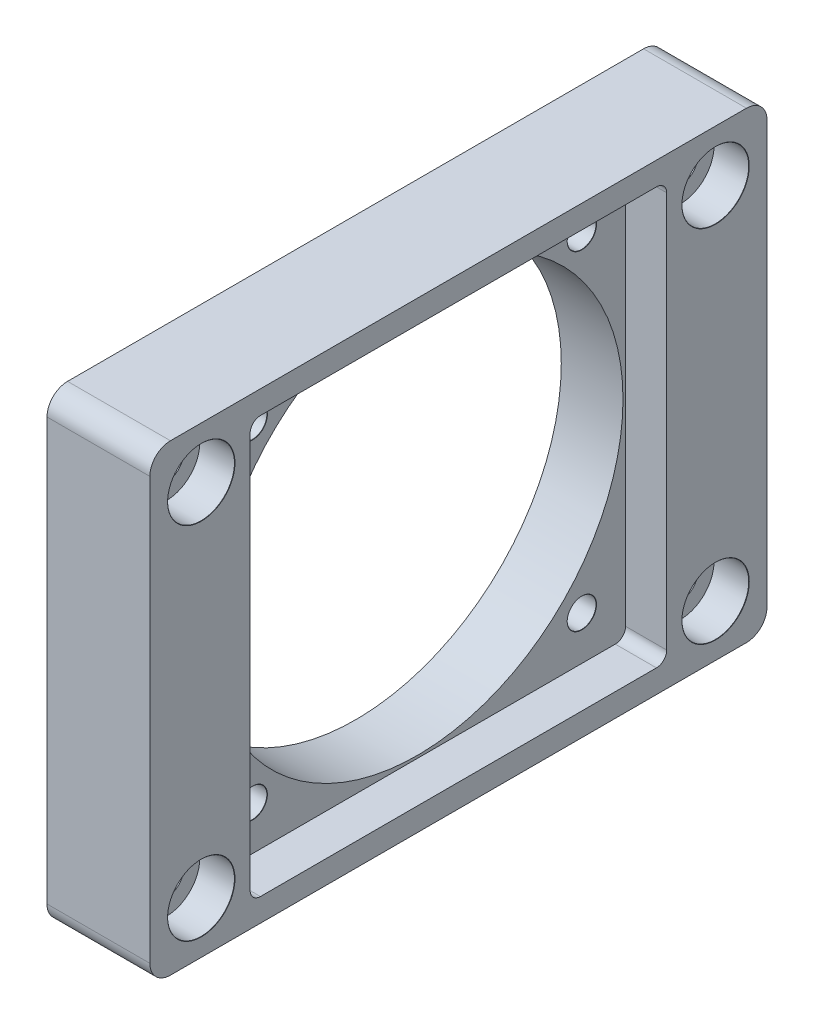
ISO-10303-21;
HEADER;
FILE_DESCRIPTION(('STEP AP214'),'2;1');
FILE_NAME('part.step','',(''),(''),'','','');
FILE_SCHEMA(('AUTOMOTIVE_DESIGN { 1 0 10303 214 1 1 1 1 }'));
ENDSEC;
DATA;
#1=APPLICATION_CONTEXT('core data for automotive mechanical design processes');
#2=APPLICATION_PROTOCOL_DEFINITION('international standard','automotive_design',2000,#1);
#3=PRODUCT_CONTEXT('',#1,'mechanical');
#4=PRODUCT('Part','Part','',(#3));
#5=PRODUCT_RELATED_PRODUCT_CATEGORY('part','',(#4));
#6=PRODUCT_DEFINITION_FORMATION('','',#4);
#7=PRODUCT_DEFINITION_CONTEXT('part definition',#1,'design');
#8=PRODUCT_DEFINITION('design','',#6,#7);
#9=PRODUCT_DEFINITION_SHAPE('','',#8);
#10=(LENGTH_UNIT() NAMED_UNIT(*) SI_UNIT(.MILLI.,.METRE.));
#11=(NAMED_UNIT(*) PLANE_ANGLE_UNIT() SI_UNIT($,.RADIAN.));
#12=(NAMED_UNIT(*) SI_UNIT($,.STERADIAN.) SOLID_ANGLE_UNIT());
#13=UNCERTAINTY_MEASURE_WITH_UNIT(LENGTH_MEASURE(1.E-05),#10,'distance_accuracy_value','');
#14=(GEOMETRIC_REPRESENTATION_CONTEXT(3) GLOBAL_UNCERTAINTY_ASSIGNED_CONTEXT((#13)) GLOBAL_UNIT_ASSIGNED_CONTEXT((#10,
#11,#12)) REPRESENTATION_CONTEXT('',''));
#15=CARTESIAN_POINT('',(0.,0.,0.));
#16=DIRECTION('',(0.,0.,1.));
#17=DIRECTION('',(1.,0.,0.));
#18=AXIS2_PLACEMENT_3D('',#15,#16,#17);
#19=CARTESIAN_POINT('',(10.,22.5,-30.));
#20=DIRECTION('',(0.,0.,1.));
#21=DIRECTION('',(0.,-1.,0.));
#22=AXIS2_PLACEMENT_3D('',#19,#20,#21);
#23=PLANE('',#22);
#24=DIRECTION('',(0.,1.,0.));
#25=VECTOR('',#24,1.);
#26=CARTESIAN_POINT('',(0.,22.5,-30.));
#27=LINE('',#26,#25);
#28=CARTESIAN_POINT('',(0.,-20.5,-30.));
#29=VERTEX_POINT('',#28);
#30=CARTESIAN_POINT('',(0.,20.5,-30.));
#31=VERTEX_POINT('',#30);
#32=EDGE_CURVE('E198',#29,#31,#27,.T.);
#33=ORIENTED_EDGE('',*,*,#32,.T.);
#34=DIRECTION('',(-1.,0.,0.));
#35=VECTOR('',#34,1.);
#36=CARTESIAN_POINT('',(10.,20.5,-30.));
#37=LINE('',#36,#35);
#38=CARTESIAN_POINT('',(10.,20.5,-30.));
#39=VERTEX_POINT('',#38);
#40=EDGE_CURVE('E254',#31,#39,#37,.F.);
#41=ORIENTED_EDGE('',*,*,#40,.T.);
#42=DIRECTION('',(0.,1.,0.));
#43=VECTOR('',#42,1.);
#44=CARTESIAN_POINT('',(10.,22.5,-30.));
#45=LINE('',#44,#43);
#46=CARTESIAN_POINT('',(10.,-20.5,-30.));
#47=VERTEX_POINT('',#46);
#48=EDGE_CURVE('E187',#47,#39,#45,.T.);
#49=ORIENTED_EDGE('',*,*,#48,.F.);
#50=DIRECTION('',(-1.,0.,0.));
#51=VECTOR('',#50,1.);
#52=CARTESIAN_POINT('',(10.,-20.5,-30.));
#53=LINE('',#52,#51);
#54=EDGE_CURVE('E251',#47,#29,#53,.T.);
#55=ORIENTED_EDGE('',*,*,#54,.T.);
#56=EDGE_LOOP('',(#33,#41,#49,#55));
#57=FACE_BOUND('',#56,.T.);
#58=ADVANCED_FACE('F34',(#57),#23,.F.);
#59=CARTESIAN_POINT('',(10.,22.5,30.));
#60=DIRECTION('',(0.,-1.,0.));
#61=DIRECTION('',(0.,0.,-1.));
#62=AXIS2_PLACEMENT_3D('',#59,#60,#61);
#63=PLANE('',#62);
#64=DIRECTION('',(0.,0.,1.));
#65=VECTOR('',#64,1.);
#66=CARTESIAN_POINT('',(10.,22.5,30.));
#67=LINE('',#66,#65);
#68=CARTESIAN_POINT('',(10.,22.5,-28.));
#69=VERTEX_POINT('',#68);
#70=CARTESIAN_POINT('',(10.,22.5,28.));
#71=VERTEX_POINT('',#70);
#72=EDGE_CURVE('E190',#69,#71,#67,.T.);
#73=ORIENTED_EDGE('',*,*,#72,.F.);
#74=DIRECTION('',(-1.,0.,0.));
#75=VECTOR('',#74,1.);
#76=CARTESIAN_POINT('',(10.,22.5,-28.));
#77=LINE('',#76,#75);
#78=CARTESIAN_POINT('',(0.,22.5,-28.));
#79=VERTEX_POINT('',#78);
#80=EDGE_CURVE('E240',#69,#79,#77,.T.);
#81=ORIENTED_EDGE('',*,*,#80,.T.);
#82=DIRECTION('',(0.,0.,1.));
#83=VECTOR('',#82,1.);
#84=CARTESIAN_POINT('',(0.,22.5,30.));
#85=LINE('',#84,#83);
#86=CARTESIAN_POINT('',(0.,22.5,28.));
#87=VERTEX_POINT('',#86);
#88=EDGE_CURVE('E201',#79,#87,#85,.T.);
#89=ORIENTED_EDGE('',*,*,#88,.T.);
#90=DIRECTION('',(-1.,0.,0.));
#91=VECTOR('',#90,1.);
#92=CARTESIAN_POINT('',(10.,22.5,28.));
#93=LINE('',#92,#91);
#94=EDGE_CURVE('E238',#87,#71,#93,.F.);
#95=ORIENTED_EDGE('',*,*,#94,.T.);
#96=EDGE_LOOP('',(#73,#81,#89,#95));
#97=FACE_BOUND('',#96,.T.);
#98=ADVANCED_FACE('F294',(#97),#63,.F.);
#99=CARTESIAN_POINT('',(10.,22.5,30.));
#100=DIRECTION('',(0.,0.,-1.));
#101=DIRECTION('',(0.,1.,0.));
#102=AXIS2_PLACEMENT_3D('',#99,#100,#101);
#103=PLANE('',#102);
#104=DIRECTION('',(0.,-1.,0.));
#105=VECTOR('',#104,1.);
#106=CARTESIAN_POINT('',(10.,22.5,30.));
#107=LINE('',#106,#105);
#108=CARTESIAN_POINT('',(10.,20.5,30.));
#109=VERTEX_POINT('',#108);
#110=CARTESIAN_POINT('',(10.,-20.5,30.));
#111=VERTEX_POINT('',#110);
#112=EDGE_CURVE('E194',#109,#111,#107,.T.);
#113=ORIENTED_EDGE('',*,*,#112,.F.);
#114=DIRECTION('',(-1.,0.,0.));
#115=VECTOR('',#114,1.);
#116=CARTESIAN_POINT('',(10.,20.5,30.));
#117=LINE('',#116,#115);
#118=CARTESIAN_POINT('',(0.,20.5,30.));
#119=VERTEX_POINT('',#118);
#120=EDGE_CURVE('E11',#109,#119,#117,.T.);
#121=ORIENTED_EDGE('',*,*,#120,.T.);
#122=DIRECTION('',(0.,-1.,0.));
#123=VECTOR('',#122,1.);
#124=CARTESIAN_POINT('',(0.,22.5,30.));
#125=LINE('',#124,#123);
#126=CARTESIAN_POINT('',(0.,-20.5,30.));
#127=VERTEX_POINT('',#126);
#128=EDGE_CURVE('E205',#119,#127,#125,.T.);
#129=ORIENTED_EDGE('',*,*,#128,.T.);
#130=DIRECTION('',(-1.,0.,0.));
#131=VECTOR('',#130,1.);
#132=CARTESIAN_POINT('',(10.,-20.5,30.));
#133=LINE('',#132,#131);
#134=EDGE_CURVE('E42',#127,#111,#133,.F.);
#135=ORIENTED_EDGE('',*,*,#134,.T.);
#136=EDGE_LOOP('',(#113,#121,#129,#135));
#137=FACE_BOUND('',#136,.T.);
#138=ADVANCED_FACE('F269',(#137),#103,.F.);
#139=CARTESIAN_POINT('',(10.,-22.5,30.));
#140=DIRECTION('',(0.,1.,0.));
#141=DIRECTION('',(0.,0.,1.));
#142=AXIS2_PLACEMENT_3D('',#139,#140,#141);
#143=PLANE('',#142);
#144=DIRECTION('',(0.,0.,-1.));
#145=VECTOR('',#144,1.);
#146=CARTESIAN_POINT('',(0.,-22.5,30.));
#147=LINE('',#146,#145);
#148=CARTESIAN_POINT('',(0.,-22.5,28.));
#149=VERTEX_POINT('',#148);
#150=CARTESIAN_POINT('',(0.,-22.5,-28.));
#151=VERTEX_POINT('',#150);
#152=EDGE_CURVE('E191',#149,#151,#147,.T.);
#153=ORIENTED_EDGE('',*,*,#152,.T.);
#154=DIRECTION('',(-1.,0.,0.));
#155=VECTOR('',#154,1.);
#156=CARTESIAN_POINT('',(10.,-22.5,-28.));
#157=LINE('',#156,#155);
#158=CARTESIAN_POINT('',(10.,-22.5,-28.));
#159=VERTEX_POINT('',#158);
#160=EDGE_CURVE('E49',#151,#159,#157,.F.);
#161=ORIENTED_EDGE('',*,*,#160,.T.);
#162=DIRECTION('',(0.,0.,-1.));
#163=VECTOR('',#162,1.);
#164=CARTESIAN_POINT('',(10.,-22.5,30.));
#165=LINE('',#164,#163);
#166=CARTESIAN_POINT('',(10.,-22.5,28.));
#167=VERTEX_POINT('',#166);
#168=EDGE_CURVE('E196',#167,#159,#165,.T.);
#169=ORIENTED_EDGE('',*,*,#168,.F.);
#170=DIRECTION('',(-1.,0.,0.));
#171=VECTOR('',#170,1.);
#172=CARTESIAN_POINT('',(10.,-22.5,28.));
#173=LINE('',#172,#171);
#174=EDGE_CURVE('E263',#167,#149,#173,.T.);
#175=ORIENTED_EDGE('',*,*,#174,.T.);
#176=EDGE_LOOP('',(#153,#161,#169,#175));
#177=FACE_BOUND('',#176,.T.);
#178=ADVANCED_FACE('F276',(#177),#143,.F.);
#179=CARTESIAN_POINT('',(10.,0.,0.));
#180=DIRECTION('',(1.,0.,0.));
#181=DIRECTION('',(0.,0.,-1.));
#182=AXIS2_PLACEMENT_3D('',#179,#180,#181);
#183=PLANE('',#182);
#184=CARTESIAN_POINT('',(10.,-17.5,-25.));
#185=DIRECTION('',(1.,0.,0.));
#186=DIRECTION('',(0.,0.,-1.));
#187=AXIS2_PLACEMENT_3D('',#184,#185,#186);
#188=CIRCLE('',#187,3.275);
#189=CARTESIAN_POINT('',(10.,-17.5,-28.275));
#190=VERTEX_POINT('',#189);
#191=EDGE_CURVE('E851',#190,#190,#188,.T.);
#192=ORIENTED_EDGE('',*,*,#191,.F.);
#193=EDGE_LOOP('',(#192));
#194=FACE_BOUND('',#193,.T.);
#195=CARTESIAN_POINT('',(10.,17.5,25.));
#196=DIRECTION('',(1.,0.,0.));
#197=DIRECTION('',(0.,0.,-1.));
#198=AXIS2_PLACEMENT_3D('',#195,#196,#197);
#199=CIRCLE('',#198,3.275);
#200=CARTESIAN_POINT('',(10.,17.5,21.725));
#201=VERTEX_POINT('',#200);
#202=EDGE_CURVE('E838',#201,#201,#199,.T.);
#203=ORIENTED_EDGE('',*,*,#202,.F.);
#204=EDGE_LOOP('',(#203));
#205=FACE_BOUND('',#204,.T.);
#206=CARTESIAN_POINT('',(10.,-17.5,25.));
#207=DIRECTION('',(1.,0.,0.));
#208=DIRECTION('',(0.,0.,-1.));
#209=AXIS2_PLACEMENT_3D('',#206,#207,#208);
#210=CIRCLE('',#209,3.275);
#211=CARTESIAN_POINT('',(10.,-17.5,21.725));
#212=VERTEX_POINT('',#211);
#213=EDGE_CURVE('E825',#212,#212,#210,.T.);
#214=ORIENTED_EDGE('',*,*,#213,.F.);
#215=EDGE_LOOP('',(#214));
#216=FACE_BOUND('',#215,.T.);
#217=CARTESIAN_POINT('',(10.,17.5,-25.));
#218=DIRECTION('',(1.,0.,0.));
#219=DIRECTION('',(0.,0.,-1.));
#220=AXIS2_PLACEMENT_3D('',#217,#218,#219);
#221=CIRCLE('',#220,3.275);
#222=CARTESIAN_POINT('',(10.,17.5,-28.275));
#223=VERTEX_POINT('',#222);
#224=EDGE_CURVE('E812',#223,#223,#221,.T.);
#225=ORIENTED_EDGE('',*,*,#224,.F.);
#226=EDGE_LOOP('',(#225));
#227=FACE_BOUND('',#226,.T.);
#228=DIRECTION('',(0.,1.,0.));
#229=VECTOR('',#228,1.);
#230=CARTESIAN_POINT('',(10.,20.25,-20.25));
#231=LINE('',#230,#229);
#232=CARTESIAN_POINT('',(10.,-19.25,-20.25));
#233=VERTEX_POINT('',#232);
#234=CARTESIAN_POINT('',(10.,19.25,-20.25));
#235=VERTEX_POINT('',#234);
#236=EDGE_CURVE('E183',#233,#235,#231,.T.);
#237=ORIENTED_EDGE('',*,*,#236,.F.);
#238=CARTESIAN_POINT('',(10.,-19.25,-19.25));
#239=DIRECTION('',(1.,0.,0.));
#240=DIRECTION('',(0.,0.,-1.));
#241=AXIS2_PLACEMENT_3D('',#238,#239,#240);
#242=CIRCLE('',#241,1.);
#243=CARTESIAN_POINT('',(10.,-20.25,-19.25));
#244=VERTEX_POINT('',#243);
#245=EDGE_CURVE('E235',#233,#244,#242,.F.);
#246=ORIENTED_EDGE('',*,*,#245,.T.);
#247=DIRECTION('',(0.,0.,-1.));
#248=VECTOR('',#247,1.);
#249=CARTESIAN_POINT('',(10.,-20.25,20.25));
#250=LINE('',#249,#248);
#251=CARTESIAN_POINT('',(10.,-20.25,19.25));
#252=VERTEX_POINT('',#251);
#253=EDGE_CURVE('E177',#252,#244,#250,.T.);
#254=ORIENTED_EDGE('',*,*,#253,.F.);
#255=CARTESIAN_POINT('',(10.,-19.25,19.25));
#256=DIRECTION('',(1.,0.,0.));
#257=DIRECTION('',(0.,0.,-1.));
#258=AXIS2_PLACEMENT_3D('',#255,#256,#257);
#259=CIRCLE('',#258,1.);
#260=CARTESIAN_POINT('',(10.,-19.25,20.25));
#261=VERTEX_POINT('',#260);
#262=EDGE_CURVE('E176',#252,#261,#259,.F.);
#263=ORIENTED_EDGE('',*,*,#262,.T.);
#264=DIRECTION('',(0.,-1.,0.));
#265=VECTOR('',#264,1.);
#266=CARTESIAN_POINT('',(10.,20.25,20.25));
#267=LINE('',#266,#265);
#268=CARTESIAN_POINT('',(10.,19.25,20.25));
#269=VERTEX_POINT('',#268);
#270=EDGE_CURVE('E166',#269,#261,#267,.T.);
#271=ORIENTED_EDGE('',*,*,#270,.F.);
#272=CARTESIAN_POINT('',(10.,19.25,19.25));
#273=DIRECTION('',(1.,0.,0.));
#274=DIRECTION('',(0.,0.,-1.));
#275=AXIS2_PLACEMENT_3D('',#272,#273,#274);
#276=CIRCLE('',#275,1.);
#277=CARTESIAN_POINT('',(10.,20.25,19.25));
#278=VERTEX_POINT('',#277);
#279=EDGE_CURVE('E149',#269,#278,#276,.F.);
#280=ORIENTED_EDGE('',*,*,#279,.T.);
#281=DIRECTION('',(0.,0.,1.));
#282=VECTOR('',#281,1.);
#283=CARTESIAN_POINT('',(10.,20.25,20.25));
#284=LINE('',#283,#282);
#285=CARTESIAN_POINT('',(10.,20.25,-19.25));
#286=VERTEX_POINT('',#285);
#287=EDGE_CURVE('E178',#286,#278,#284,.T.);
#288=ORIENTED_EDGE('',*,*,#287,.F.);
#289=CARTESIAN_POINT('',(10.,19.25,-19.25));
#290=DIRECTION('',(1.,0.,0.));
#291=DIRECTION('',(0.,0.,-1.));
#292=AXIS2_PLACEMENT_3D('',#289,#290,#291);
#293=CIRCLE('',#292,1.);
#294=EDGE_CURVE('E159',#286,#235,#293,.F.);
#295=ORIENTED_EDGE('',*,*,#294,.T.);
#296=EDGE_LOOP('',(#237,#246,#254,#263,#271,#280,#288,#295));
#297=FACE_BOUND('',#296,.T.);
#298=ORIENTED_EDGE('',*,*,#48,.T.);
#299=CARTESIAN_POINT('',(10.,20.5,-28.));
#300=DIRECTION('',(1.,0.,0.));
#301=DIRECTION('',(0.,0.,-1.));
#302=AXIS2_PLACEMENT_3D('',#299,#300,#301);
#303=CIRCLE('',#302,2.);
#304=EDGE_CURVE('E261',#39,#69,#303,.T.);
#305=ORIENTED_EDGE('',*,*,#304,.T.);
#306=ORIENTED_EDGE('',*,*,#72,.T.);
#307=CARTESIAN_POINT('',(10.,20.5,28.));
#308=DIRECTION('',(1.,0.,0.));
#309=DIRECTION('',(0.,0.,-1.));
#310=AXIS2_PLACEMENT_3D('',#307,#308,#309);
#311=CIRCLE('',#310,2.);
#312=EDGE_CURVE('E257',#71,#109,#311,.T.);
#313=ORIENTED_EDGE('',*,*,#312,.T.);
#314=ORIENTED_EDGE('',*,*,#112,.T.);
#315=CARTESIAN_POINT('',(10.,-20.5,28.));
#316=DIRECTION('',(1.,0.,0.));
#317=DIRECTION('',(0.,0.,-1.));
#318=AXIS2_PLACEMENT_3D('',#315,#316,#317);
#319=CIRCLE('',#318,2.);
#320=EDGE_CURVE('E56',#111,#167,#319,.T.);
#321=ORIENTED_EDGE('',*,*,#320,.T.);
#322=ORIENTED_EDGE('',*,*,#168,.T.);
#323=CARTESIAN_POINT('',(10.,-20.5,-28.));
#324=DIRECTION('',(1.,0.,0.));
#325=DIRECTION('',(0.,0.,-1.));
#326=AXIS2_PLACEMENT_3D('',#323,#324,#325);
#327=CIRCLE('',#326,2.);
#328=EDGE_CURVE('E259',#159,#47,#327,.T.);
#329=ORIENTED_EDGE('',*,*,#328,.T.);
#330=EDGE_LOOP('',(#298,#305,#306,#313,#314,#321,#322,#329));
#331=FACE_BOUND('',#330,.T.);
#332=ADVANCED_FACE('F174',(#194,#205,#216,#227,#297,#331),#183,.T.);
#333=CARTESIAN_POINT('',(0.,0.,0.));
#334=DIRECTION('',(1.,0.,0.));
#335=DIRECTION('',(0.,0.,-1.));
#336=AXIS2_PLACEMENT_3D('',#333,#334,#335);
#337=PLANE('',#336);
#338=CARTESIAN_POINT('',(0.,-17.5,-25.));
#339=DIRECTION('',(1.,0.,0.));
#340=DIRECTION('',(0.,0.,-1.));
#341=AXIS2_PLACEMENT_3D('',#338,#339,#340);
#342=CIRCLE('',#341,1.7);
#343=CARTESIAN_POINT('',(0.,-17.5,-26.7));
#344=VERTEX_POINT('',#343);
#345=EDGE_CURVE('E719',#344,#344,#342,.T.);
#346=ORIENTED_EDGE('',*,*,#345,.T.);
#347=EDGE_LOOP('',(#346));
#348=FACE_BOUND('',#347,.T.);
#349=CARTESIAN_POINT('',(0.,17.5,25.));
#350=DIRECTION('',(1.,0.,0.));
#351=DIRECTION('',(0.,0.,-1.));
#352=AXIS2_PLACEMENT_3D('',#349,#350,#351);
#353=CIRCLE('',#352,1.7);
#354=CARTESIAN_POINT('',(0.,17.5,23.3));
#355=VERTEX_POINT('',#354);
#356=EDGE_CURVE('E723',#355,#355,#353,.T.);
#357=ORIENTED_EDGE('',*,*,#356,.T.);
#358=EDGE_LOOP('',(#357));
#359=FACE_BOUND('',#358,.T.);
#360=CARTESIAN_POINT('',(0.,-17.5,25.));
#361=DIRECTION('',(1.,0.,0.));
#362=DIRECTION('',(0.,0.,-1.));
#363=AXIS2_PLACEMENT_3D('',#360,#361,#362);
#364=CIRCLE('',#363,1.7);
#365=CARTESIAN_POINT('',(0.,-17.5,23.3));
#366=VERTEX_POINT('',#365);
#367=EDGE_CURVE('E727',#366,#366,#364,.T.);
#368=ORIENTED_EDGE('',*,*,#367,.T.);
#369=EDGE_LOOP('',(#368));
#370=FACE_BOUND('',#369,.T.);
#371=CARTESIAN_POINT('',(0.,17.5,-25.));
#372=DIRECTION('',(1.,0.,0.));
#373=DIRECTION('',(0.,0.,-1.));
#374=AXIS2_PLACEMENT_3D('',#371,#372,#373);
#375=CIRCLE('',#374,1.7);
#376=CARTESIAN_POINT('',(0.,17.5,-26.7));
#377=VERTEX_POINT('',#376);
#378=EDGE_CURVE('E731',#377,#377,#375,.T.);
#379=ORIENTED_EDGE('',*,*,#378,.T.);
#380=EDGE_LOOP('',(#379));
#381=FACE_BOUND('',#380,.T.);
#382=CARTESIAN_POINT('',(0.,-16.,-16.));
#383=DIRECTION('',(1.,0.,0.));
#384=DIRECTION('',(0.,0.,-1.));
#385=AXIS2_PLACEMENT_3D('',#382,#383,#384);
#386=CIRCLE('',#385,1.39999999999999);
#387=CARTESIAN_POINT('',(0.,-16.,-17.4));
#388=VERTEX_POINT('',#387);
#389=EDGE_CURVE('E735',#388,#388,#386,.T.);
#390=ORIENTED_EDGE('',*,*,#389,.T.);
#391=EDGE_LOOP('',(#390));
#392=FACE_BOUND('',#391,.T.);
#393=CARTESIAN_POINT('',(0.,16.,16.));
#394=DIRECTION('',(1.,0.,0.));
#395=DIRECTION('',(0.,0.,-1.));
#396=AXIS2_PLACEMENT_3D('',#393,#394,#395);
#397=CIRCLE('',#396,1.4);
#398=CARTESIAN_POINT('',(0.,16.,14.6));
#399=VERTEX_POINT('',#398);
#400=EDGE_CURVE('E739',#399,#399,#397,.T.);
#401=ORIENTED_EDGE('',*,*,#400,.T.);
#402=EDGE_LOOP('',(#401));
#403=FACE_BOUND('',#402,.T.);
#404=CARTESIAN_POINT('',(0.,-16.,16.));
#405=DIRECTION('',(1.,0.,0.));
#406=DIRECTION('',(0.,0.,-1.));
#407=AXIS2_PLACEMENT_3D('',#404,#405,#406);
#408=CIRCLE('',#407,1.39999999999999);
#409=CARTESIAN_POINT('',(0.,-16.,14.6));
#410=VERTEX_POINT('',#409);
#411=EDGE_CURVE('E743',#410,#410,#408,.T.);
#412=ORIENTED_EDGE('',*,*,#411,.T.);
#413=EDGE_LOOP('',(#412));
#414=FACE_BOUND('',#413,.T.);
#415=CARTESIAN_POINT('',(0.,16.,-16.));
#416=DIRECTION('',(1.,0.,0.));
#417=DIRECTION('',(0.,0.,-1.));
#418=AXIS2_PLACEMENT_3D('',#415,#416,#417);
#419=CIRCLE('',#418,1.4);
#420=CARTESIAN_POINT('',(0.,16.,-17.4));
#421=VERTEX_POINT('',#420);
#422=EDGE_CURVE('E747',#421,#421,#419,.T.);
#423=ORIENTED_EDGE('',*,*,#422,.T.);
#424=EDGE_LOOP('',(#423));
#425=FACE_BOUND('',#424,.T.);
#426=CARTESIAN_POINT('',(0.,0.,0.));
#427=DIRECTION('',(1.,0.,0.));
#428=DIRECTION('',(0.,0.,-1.));
#429=AXIS2_PLACEMENT_3D('',#426,#427,#428);
#430=CIRCLE('',#429,20.);
#431=CARTESIAN_POINT('',(0.,0.,-20.));
#432=VERTEX_POINT('',#431);
#433=EDGE_CURVE('E209',#432,#432,#430,.T.);
#434=ORIENTED_EDGE('',*,*,#433,.T.);
#435=EDGE_LOOP('',(#434));
#436=FACE_BOUND('',#435,.T.);
#437=ORIENTED_EDGE('',*,*,#88,.F.);
#438=CARTESIAN_POINT('',(0.,20.5,-28.));
#439=DIRECTION('',(1.,0.,0.));
#440=DIRECTION('',(0.,0.,-1.));
#441=AXIS2_PLACEMENT_3D('',#438,#439,#440);
#442=CIRCLE('',#441,2.);
#443=EDGE_CURVE('E249',#79,#31,#442,.F.);
#444=ORIENTED_EDGE('',*,*,#443,.T.);
#445=ORIENTED_EDGE('',*,*,#32,.F.);
#446=CARTESIAN_POINT('',(0.,-20.5,-28.));
#447=DIRECTION('',(1.,0.,0.));
#448=DIRECTION('',(0.,0.,-1.));
#449=AXIS2_PLACEMENT_3D('',#446,#447,#448);
#450=CIRCLE('',#449,2.);
#451=EDGE_CURVE('E247',#29,#151,#450,.F.);
#452=ORIENTED_EDGE('',*,*,#451,.T.);
#453=ORIENTED_EDGE('',*,*,#152,.F.);
#454=CARTESIAN_POINT('',(0.,-20.5,28.));
#455=DIRECTION('',(1.,0.,0.));
#456=DIRECTION('',(0.,0.,-1.));
#457=AXIS2_PLACEMENT_3D('',#454,#455,#456);
#458=CIRCLE('',#457,2.);
#459=EDGE_CURVE('E243',#149,#127,#458,.F.);
#460=ORIENTED_EDGE('',*,*,#459,.T.);
#461=ORIENTED_EDGE('',*,*,#128,.F.);
#462=CARTESIAN_POINT('',(0.,20.5,28.));
#463=DIRECTION('',(1.,0.,0.));
#464=DIRECTION('',(0.,0.,-1.));
#465=AXIS2_PLACEMENT_3D('',#462,#463,#464);
#466=CIRCLE('',#465,2.);
#467=EDGE_CURVE('E245',#119,#87,#466,.F.);
#468=ORIENTED_EDGE('',*,*,#467,.T.);
#469=EDGE_LOOP('',(#437,#444,#445,#452,#453,#460,#461,#468));
#470=FACE_BOUND('',#469,.T.);
#471=ADVANCED_FACE('F279',(#348,#359,#370,#381,#392,#403,#414,#425,#436,#470),#337,.F.);
#472=CARTESIAN_POINT('',(6.,20.25,-20.25));
#473=DIRECTION('',(0.,0.,-1.));
#474=DIRECTION('',(0.,1.,0.));
#475=AXIS2_PLACEMENT_3D('',#472,#473,#474);
#476=PLANE('',#475);
#477=ORIENTED_EDGE('',*,*,#236,.T.);
#478=DIRECTION('',(1.,0.,0.));
#479=VECTOR('',#478,1.);
#480=CARTESIAN_POINT('',(6.,19.25,-20.25));
#481=LINE('',#480,#479);
#482=CARTESIAN_POINT('',(6.,19.25,-20.25));
#483=VERTEX_POINT('',#482);
#484=EDGE_CURVE('E228',#235,#483,#481,.F.);
#485=ORIENTED_EDGE('',*,*,#484,.T.);
#486=DIRECTION('',(0.,1.,0.));
#487=VECTOR('',#486,1.);
#488=CARTESIAN_POINT('',(6.,20.25,-20.25));
#489=LINE('',#488,#487);
#490=CARTESIAN_POINT('',(6.,-19.25,-20.25));
#491=VERTEX_POINT('',#490);
#492=EDGE_CURVE('E181',#491,#483,#489,.T.);
#493=ORIENTED_EDGE('',*,*,#492,.F.);
#494=DIRECTION('',(1.,0.,0.));
#495=VECTOR('',#494,1.);
#496=CARTESIAN_POINT('',(10.,-19.25,-20.25));
#497=LINE('',#496,#495);
#498=EDGE_CURVE('E225',#491,#233,#497,.T.);
#499=ORIENTED_EDGE('',*,*,#498,.T.);
#500=EDGE_LOOP('',(#477,#485,#493,#499));
#501=FACE_BOUND('',#500,.T.);
#502=ADVANCED_FACE('F442',(#501),#476,.F.);
#503=CARTESIAN_POINT('',(6.,-20.25,20.25));
#504=DIRECTION('',(0.,-1.,0.));
#505=DIRECTION('',(0.,0.,-1.));
#506=AXIS2_PLACEMENT_3D('',#503,#504,#505);
#507=PLANE('',#506);
#508=ORIENTED_EDGE('',*,*,#253,.T.);
#509=DIRECTION('',(1.,0.,0.));
#510=VECTOR('',#509,1.);
#511=CARTESIAN_POINT('',(6.,-20.25,-19.25));
#512=LINE('',#511,#510);
#513=CARTESIAN_POINT('',(6.,-20.25,-19.25));
#514=VERTEX_POINT('',#513);
#515=EDGE_CURVE('E160',#244,#514,#512,.F.);
#516=ORIENTED_EDGE('',*,*,#515,.T.);
#517=DIRECTION('',(0.,0.,-1.));
#518=VECTOR('',#517,1.);
#519=CARTESIAN_POINT('',(6.,-20.25,20.25));
#520=LINE('',#519,#518);
#521=CARTESIAN_POINT('',(6.,-20.25,19.25));
#522=VERTEX_POINT('',#521);
#523=EDGE_CURVE('E202',#522,#514,#520,.T.);
#524=ORIENTED_EDGE('',*,*,#523,.F.);
#525=DIRECTION('',(1.,0.,0.));
#526=VECTOR('',#525,1.);
#527=CARTESIAN_POINT('',(10.,-20.25,19.25));
#528=LINE('',#527,#526);
#529=EDGE_CURVE('E230',#522,#252,#528,.T.);
#530=ORIENTED_EDGE('',*,*,#529,.T.);
#531=EDGE_LOOP('',(#508,#516,#524,#530));
#532=FACE_BOUND('',#531,.T.);
#533=ADVANCED_FACE('F439',(#532),#507,.F.);
#534=CARTESIAN_POINT('',(6.,20.25,20.25));
#535=DIRECTION('',(0.,0.,1.));
#536=DIRECTION('',(0.,-1.,0.));
#537=AXIS2_PLACEMENT_3D('',#534,#535,#536);
#538=PLANE('',#537);
#539=DIRECTION('',(0.,-1.,0.));
#540=VECTOR('',#539,1.);
#541=CARTESIAN_POINT('',(6.,20.25,20.25));
#542=LINE('',#541,#540);
#543=CARTESIAN_POINT('',(6.,19.25,20.25));
#544=VERTEX_POINT('',#543);
#545=CARTESIAN_POINT('',(6.,-19.25,20.25));
#546=VERTEX_POINT('',#545);
#547=EDGE_CURVE('E169',#544,#546,#542,.T.);
#548=ORIENTED_EDGE('',*,*,#547,.F.);
#549=DIRECTION('',(1.,0.,0.));
#550=VECTOR('',#549,1.);
#551=CARTESIAN_POINT('',(10.,19.25,20.25));
#552=LINE('',#551,#550);
#553=EDGE_CURVE('E153',#544,#269,#552,.T.);
#554=ORIENTED_EDGE('',*,*,#553,.T.);
#555=ORIENTED_EDGE('',*,*,#270,.T.);
#556=DIRECTION('',(1.,0.,0.));
#557=VECTOR('',#556,1.);
#558=CARTESIAN_POINT('',(6.,-19.25,20.25));
#559=LINE('',#558,#557);
#560=EDGE_CURVE('E171',#261,#546,#559,.F.);
#561=ORIENTED_EDGE('',*,*,#560,.T.);
#562=EDGE_LOOP('',(#548,#554,#555,#561));
#563=FACE_BOUND('',#562,.T.);
#564=ADVANCED_FACE('F165',(#563),#538,.F.);
#565=CARTESIAN_POINT('',(6.,20.25,20.25));
#566=DIRECTION('',(0.,1.,0.));
#567=DIRECTION('',(0.,0.,1.));
#568=AXIS2_PLACEMENT_3D('',#565,#566,#567);
#569=PLANE('',#568);
#570=ORIENTED_EDGE('',*,*,#287,.T.);
#571=DIRECTION('',(1.,0.,0.));
#572=VECTOR('',#571,1.);
#573=CARTESIAN_POINT('',(6.,20.25,19.25));
#574=LINE('',#573,#572);
#575=CARTESIAN_POINT('',(6.,20.25,19.25));
#576=VERTEX_POINT('',#575);
#577=EDGE_CURVE('E154',#278,#576,#574,.F.);
#578=ORIENTED_EDGE('',*,*,#577,.T.);
#579=DIRECTION('',(0.,0.,1.));
#580=VECTOR('',#579,1.);
#581=CARTESIAN_POINT('',(6.,20.25,20.25));
#582=LINE('',#581,#580);
#583=CARTESIAN_POINT('',(6.,20.25,-19.25));
#584=VERTEX_POINT('',#583);
#585=EDGE_CURVE('E761',#584,#576,#582,.T.);
#586=ORIENTED_EDGE('',*,*,#585,.F.);
#587=DIRECTION('',(1.,0.,0.));
#588=VECTOR('',#587,1.);
#589=CARTESIAN_POINT('',(10.,20.25,-19.25));
#590=LINE('',#589,#588);
#591=EDGE_CURVE('E170',#584,#286,#590,.T.);
#592=ORIENTED_EDGE('',*,*,#591,.T.);
#593=EDGE_LOOP('',(#570,#578,#586,#592));
#594=FACE_BOUND('',#593,.T.);
#595=ADVANCED_FACE('F437',(#594),#569,.F.);
#596=CARTESIAN_POINT('',(6.,0.,0.));
#597=DIRECTION('',(1.,0.,0.));
#598=DIRECTION('',(0.,0.,-1.));
#599=AXIS2_PLACEMENT_3D('',#596,#597,#598);
#600=PLANE('',#599);
#601=CARTESIAN_POINT('',(6.,-16.,-16.));
#602=DIRECTION('',(1.,0.,0.));
#603=DIRECTION('',(0.,0.,-1.));
#604=AXIS2_PLACEMENT_3D('',#601,#602,#603);
#605=CIRCLE('',#604,1.425);
#606=CARTESIAN_POINT('',(6.,-16.,-17.425));
#607=VERTEX_POINT('',#606);
#608=EDGE_CURVE('E799',#607,#607,#605,.T.);
#609=ORIENTED_EDGE('',*,*,#608,.F.);
#610=EDGE_LOOP('',(#609));
#611=FACE_BOUND('',#610,.T.);
#612=CARTESIAN_POINT('',(6.,16.,16.));
#613=DIRECTION('',(1.,0.,0.));
#614=DIRECTION('',(0.,0.,-1.));
#615=AXIS2_PLACEMENT_3D('',#612,#613,#614);
#616=CIRCLE('',#615,1.425);
#617=CARTESIAN_POINT('',(6.,16.,14.575));
#618=VERTEX_POINT('',#617);
#619=EDGE_CURVE('E792',#618,#618,#616,.T.);
#620=ORIENTED_EDGE('',*,*,#619,.F.);
#621=EDGE_LOOP('',(#620));
#622=FACE_BOUND('',#621,.T.);
#623=CARTESIAN_POINT('',(6.,-16.,16.));
#624=DIRECTION('',(1.,0.,0.));
#625=DIRECTION('',(0.,0.,-1.));
#626=AXIS2_PLACEMENT_3D('',#623,#624,#625);
#627=CIRCLE('',#626,1.425);
#628=CARTESIAN_POINT('',(6.,-16.,14.575));
#629=VERTEX_POINT('',#628);
#630=EDGE_CURVE('E785',#629,#629,#627,.T.);
#631=ORIENTED_EDGE('',*,*,#630,.F.);
#632=EDGE_LOOP('',(#631));
#633=FACE_BOUND('',#632,.T.);
#634=CARTESIAN_POINT('',(6.,16.,-16.));
#635=DIRECTION('',(1.,0.,0.));
#636=DIRECTION('',(0.,0.,-1.));
#637=AXIS2_PLACEMENT_3D('',#634,#635,#636);
#638=CIRCLE('',#637,1.425);
#639=CARTESIAN_POINT('',(6.,16.,-17.425));
#640=VERTEX_POINT('',#639);
#641=EDGE_CURVE('E755',#640,#640,#638,.T.);
#642=ORIENTED_EDGE('',*,*,#641,.F.);
#643=EDGE_LOOP('',(#642));
#644=FACE_BOUND('',#643,.T.);
#645=CARTESIAN_POINT('',(6.,0.,0.));
#646=DIRECTION('',(1.,0.,0.));
#647=DIRECTION('',(0.,0.,-1.));
#648=AXIS2_PLACEMENT_3D('',#645,#646,#647);
#649=CIRCLE('',#648,20.);
#650=CARTESIAN_POINT('',(6.,0.,-20.));
#651=VERTEX_POINT('',#650);
#652=EDGE_CURVE('E212',#651,#651,#649,.T.);
#653=ORIENTED_EDGE('',*,*,#652,.F.);
#654=EDGE_LOOP('',(#653));
#655=FACE_BOUND('',#654,.T.);
#656=ORIENTED_EDGE('',*,*,#585,.T.);
#657=CARTESIAN_POINT('',(6.,19.25,19.25));
#658=DIRECTION('',(1.,0.,0.));
#659=DIRECTION('',(0.,0.,-1.));
#660=AXIS2_PLACEMENT_3D('',#657,#658,#659);
#661=CIRCLE('',#660,1.);
#662=EDGE_CURVE('E223',#576,#544,#661,.T.);
#663=ORIENTED_EDGE('',*,*,#662,.T.);
#664=ORIENTED_EDGE('',*,*,#547,.T.);
#665=CARTESIAN_POINT('',(6.,-19.25,19.25));
#666=DIRECTION('',(1.,0.,0.));
#667=DIRECTION('',(0.,0.,-1.));
#668=AXIS2_PLACEMENT_3D('',#665,#666,#667);
#669=CIRCLE('',#668,1.);
#670=EDGE_CURVE('E217',#546,#522,#669,.T.);
#671=ORIENTED_EDGE('',*,*,#670,.T.);
#672=ORIENTED_EDGE('',*,*,#523,.T.);
#673=CARTESIAN_POINT('',(6.,-19.25,-19.25));
#674=DIRECTION('',(1.,0.,0.));
#675=DIRECTION('',(0.,0.,-1.));
#676=AXIS2_PLACEMENT_3D('',#673,#674,#675);
#677=CIRCLE('',#676,1.);
#678=EDGE_CURVE('E219',#514,#491,#677,.T.);
#679=ORIENTED_EDGE('',*,*,#678,.T.);
#680=ORIENTED_EDGE('',*,*,#492,.T.);
#681=CARTESIAN_POINT('',(6.,19.25,-19.25));
#682=DIRECTION('',(1.,0.,0.));
#683=DIRECTION('',(0.,0.,-1.));
#684=AXIS2_PLACEMENT_3D('',#681,#682,#683);
#685=CIRCLE('',#684,1.);
#686=EDGE_CURVE('E221',#483,#584,#685,.T.);
#687=ORIENTED_EDGE('',*,*,#686,.T.);
#688=EDGE_LOOP('',(#656,#663,#664,#671,#672,#679,#680,#687));
#689=FACE_BOUND('',#688,.T.);
#690=ADVANCED_FACE('F433',(#611,#622,#633,#644,#655,#689),#600,.T.);
#691=CARTESIAN_POINT('',(-4.,0.,0.));
#692=DIRECTION('',(1.,0.,0.));
#693=DIRECTION('',(0.,0.,-1.));
#694=AXIS2_PLACEMENT_3D('',#691,#692,#693);
#695=CYLINDRICAL_SURFACE('',#694,20.);
#696=ORIENTED_EDGE('',*,*,#652,.T.);
#697=EDGE_LOOP('',(#696));
#698=FACE_BOUND('',#697,.T.);
#699=ORIENTED_EDGE('',*,*,#433,.F.);
#700=EDGE_LOOP('',(#699));
#701=FACE_BOUND('',#700,.T.);
#702=ADVANCED_FACE('F315',(#698,#701),#695,.F.);
#703=CARTESIAN_POINT('',(6.,19.25,19.25));
#704=DIRECTION('',(-1.,0.,0.));
#705=DIRECTION('',(0.,0.,1.));
#706=AXIS2_PLACEMENT_3D('',#703,#704,#705);
#707=CYLINDRICAL_SURFACE('',#706,1.);
#708=ORIENTED_EDGE('',*,*,#662,.F.);
#709=ORIENTED_EDGE('',*,*,#577,.F.);
#710=ORIENTED_EDGE('',*,*,#279,.F.);
#711=ORIENTED_EDGE('',*,*,#553,.F.);
#712=EDGE_LOOP('',(#708,#709,#710,#711));
#713=FACE_BOUND('',#712,.T.);
#714=ADVANCED_FACE('F152',(#713),#707,.F.);
#715=CARTESIAN_POINT('',(6.,19.25,-19.25));
#716=DIRECTION('',(-1.,0.,0.));
#717=DIRECTION('',(0.,0.,1.));
#718=AXIS2_PLACEMENT_3D('',#715,#716,#717);
#719=CYLINDRICAL_SURFACE('',#718,1.);
#720=ORIENTED_EDGE('',*,*,#686,.F.);
#721=ORIENTED_EDGE('',*,*,#484,.F.);
#722=ORIENTED_EDGE('',*,*,#294,.F.);
#723=ORIENTED_EDGE('',*,*,#591,.F.);
#724=EDGE_LOOP('',(#720,#721,#722,#723));
#725=FACE_BOUND('',#724,.T.);
#726=ADVANCED_FACE('F314',(#725),#719,.F.);
#727=CARTESIAN_POINT('',(6.,-19.25,-19.25));
#728=DIRECTION('',(-1.,0.,0.));
#729=DIRECTION('',(0.,0.,1.));
#730=AXIS2_PLACEMENT_3D('',#727,#728,#729);
#731=CYLINDRICAL_SURFACE('',#730,1.);
#732=ORIENTED_EDGE('',*,*,#678,.F.);
#733=ORIENTED_EDGE('',*,*,#515,.F.);
#734=ORIENTED_EDGE('',*,*,#245,.F.);
#735=ORIENTED_EDGE('',*,*,#498,.F.);
#736=EDGE_LOOP('',(#732,#733,#734,#735));
#737=FACE_BOUND('',#736,.T.);
#738=ADVANCED_FACE('F318',(#737),#731,.F.);
#739=CARTESIAN_POINT('',(6.,-19.25,19.25));
#740=DIRECTION('',(-1.,0.,0.));
#741=DIRECTION('',(0.,0.,1.));
#742=AXIS2_PLACEMENT_3D('',#739,#740,#741);
#743=CYLINDRICAL_SURFACE('',#742,1.);
#744=ORIENTED_EDGE('',*,*,#670,.F.);
#745=ORIENTED_EDGE('',*,*,#560,.F.);
#746=ORIENTED_EDGE('',*,*,#262,.F.);
#747=ORIENTED_EDGE('',*,*,#529,.F.);
#748=EDGE_LOOP('',(#744,#745,#746,#747));
#749=FACE_BOUND('',#748,.T.);
#750=ADVANCED_FACE('F322',(#749),#743,.F.);
#751=CARTESIAN_POINT('',(6.,16.,-16.));
#752=DIRECTION('',(1.,0.,0.));
#753=DIRECTION('',(0.,0.,-1.));
#754=AXIS2_PLACEMENT_3D('',#751,#752,#753);
#755=CYLINDRICAL_SURFACE('',#754,1.4);
#756=ORIENTED_EDGE('',*,*,#422,.F.);
#757=EDGE_LOOP('',(#756));
#758=FACE_BOUND('',#757,.T.);
#759=CARTESIAN_POINT('',(5.975,16.,-16.));
#760=DIRECTION('',(1.,0.,0.));
#761=DIRECTION('',(0.,0.,-1.));
#762=AXIS2_PLACEMENT_3D('',#759,#760,#761);
#763=CIRCLE('',#762,1.4);
#764=CARTESIAN_POINT('',(5.975,16.,-17.4));
#765=VERTEX_POINT('',#764);
#766=EDGE_CURVE('E750',#765,#765,#763,.T.);
#767=ORIENTED_EDGE('',*,*,#766,.T.);
#768=EDGE_LOOP('',(#767));
#769=FACE_BOUND('',#768,.T.);
#770=ADVANCED_FACE('F326',(#758,#769),#755,.F.);
#771=CARTESIAN_POINT('',(6.,16.,-16.));
#772=DIRECTION('',(1.,0.,0.));
#773=DIRECTION('',(0.,0.,-1.));
#774=AXIS2_PLACEMENT_3D('',#771,#772,#773);
#775=CONICAL_SURFACE('',#774,1.425,0.785398163397448);
#776=ORIENTED_EDGE('',*,*,#766,.F.);
#777=EDGE_LOOP('',(#776));
#778=FACE_BOUND('',#777,.T.);
#779=ORIENTED_EDGE('',*,*,#641,.T.);
#780=EDGE_LOOP('',(#779));
#781=FACE_BOUND('',#780,.T.);
#782=ADVANCED_FACE('F423',(#778,#781),#775,.F.);
#783=CARTESIAN_POINT('',(6.,-16.,16.));
#784=DIRECTION('',(1.,0.,0.));
#785=DIRECTION('',(0.,0.,-1.));
#786=AXIS2_PLACEMENT_3D('',#783,#784,#785);
#787=CYLINDRICAL_SURFACE('',#786,1.39999999999999);
#788=ORIENTED_EDGE('',*,*,#411,.F.);
#789=EDGE_LOOP('',(#788));
#790=FACE_BOUND('',#789,.T.);
#791=CARTESIAN_POINT('',(5.975,-16.,16.));
#792=DIRECTION('',(1.,0.,0.));
#793=DIRECTION('',(0.,0.,-1.));
#794=AXIS2_PLACEMENT_3D('',#791,#792,#793);
#795=CIRCLE('',#794,1.4);
#796=CARTESIAN_POINT('',(5.975,-16.,14.6));
#797=VERTEX_POINT('',#796);
#798=EDGE_CURVE('E782',#797,#797,#795,.T.);
#799=ORIENTED_EDGE('',*,*,#798,.T.);
#800=EDGE_LOOP('',(#799));
#801=FACE_BOUND('',#800,.T.);
#802=ADVANCED_FACE('F419',(#790,#801),#787,.F.);
#803=CARTESIAN_POINT('',(6.,-16.,16.));
#804=DIRECTION('',(1.,0.,0.));
#805=DIRECTION('',(0.,0.,-1.));
#806=AXIS2_PLACEMENT_3D('',#803,#804,#805);
#807=CONICAL_SURFACE('',#806,1.425,0.785398163397448);
#808=ORIENTED_EDGE('',*,*,#798,.F.);
#809=EDGE_LOOP('',(#808));
#810=FACE_BOUND('',#809,.T.);
#811=ORIENTED_EDGE('',*,*,#630,.T.);
#812=EDGE_LOOP('',(#811));
#813=FACE_BOUND('',#812,.T.);
#814=ADVANCED_FACE('F415',(#810,#813),#807,.F.);
#815=CARTESIAN_POINT('',(6.,16.,16.));
#816=DIRECTION('',(1.,0.,0.));
#817=DIRECTION('',(0.,0.,-1.));
#818=AXIS2_PLACEMENT_3D('',#815,#816,#817);
#819=CYLINDRICAL_SURFACE('',#818,1.4);
#820=ORIENTED_EDGE('',*,*,#400,.F.);
#821=EDGE_LOOP('',(#820));
#822=FACE_BOUND('',#821,.T.);
#823=CARTESIAN_POINT('',(5.975,16.,16.));
#824=DIRECTION('',(1.,0.,0.));
#825=DIRECTION('',(0.,0.,-1.));
#826=AXIS2_PLACEMENT_3D('',#823,#824,#825);
#827=CIRCLE('',#826,1.4);
#828=CARTESIAN_POINT('',(5.975,16.,14.6));
#829=VERTEX_POINT('',#828);
#830=EDGE_CURVE('E789',#829,#829,#827,.T.);
#831=ORIENTED_EDGE('',*,*,#830,.T.);
#832=EDGE_LOOP('',(#831));
#833=FACE_BOUND('',#832,.T.);
#834=ADVANCED_FACE('F411',(#822,#833),#819,.F.);
#835=CARTESIAN_POINT('',(6.,16.,16.));
#836=DIRECTION('',(1.,0.,0.));
#837=DIRECTION('',(0.,0.,-1.));
#838=AXIS2_PLACEMENT_3D('',#835,#836,#837);
#839=CONICAL_SURFACE('',#838,1.425,0.785398163397448);
#840=ORIENTED_EDGE('',*,*,#830,.F.);
#841=EDGE_LOOP('',(#840));
#842=FACE_BOUND('',#841,.T.);
#843=ORIENTED_EDGE('',*,*,#619,.T.);
#844=EDGE_LOOP('',(#843));
#845=FACE_BOUND('',#844,.T.);
#846=ADVANCED_FACE('F407',(#842,#845),#839,.F.);
#847=CARTESIAN_POINT('',(6.,-16.,-16.));
#848=DIRECTION('',(1.,0.,0.));
#849=DIRECTION('',(0.,0.,-1.));
#850=AXIS2_PLACEMENT_3D('',#847,#848,#849);
#851=CYLINDRICAL_SURFACE('',#850,1.39999999999999);
#852=ORIENTED_EDGE('',*,*,#389,.F.);
#853=EDGE_LOOP('',(#852));
#854=FACE_BOUND('',#853,.T.);
#855=CARTESIAN_POINT('',(5.975,-16.,-16.));
#856=DIRECTION('',(1.,0.,0.));
#857=DIRECTION('',(0.,0.,-1.));
#858=AXIS2_PLACEMENT_3D('',#855,#856,#857);
#859=CIRCLE('',#858,1.4);
#860=CARTESIAN_POINT('',(5.975,-16.,-17.4));
#861=VERTEX_POINT('',#860);
#862=EDGE_CURVE('E796',#861,#861,#859,.T.);
#863=ORIENTED_EDGE('',*,*,#862,.T.);
#864=EDGE_LOOP('',(#863));
#865=FACE_BOUND('',#864,.T.);
#866=ADVANCED_FACE('F403',(#854,#865),#851,.F.);
#867=CARTESIAN_POINT('',(6.,-16.,-16.));
#868=DIRECTION('',(1.,0.,0.));
#869=DIRECTION('',(0.,0.,-1.));
#870=AXIS2_PLACEMENT_3D('',#867,#868,#869);
#871=CONICAL_SURFACE('',#870,1.425,0.785398163397448);
#872=ORIENTED_EDGE('',*,*,#862,.F.);
#873=EDGE_LOOP('',(#872));
#874=FACE_BOUND('',#873,.T.);
#875=ORIENTED_EDGE('',*,*,#608,.T.);
#876=EDGE_LOOP('',(#875));
#877=FACE_BOUND('',#876,.T.);
#878=ADVANCED_FACE('F399',(#874,#877),#871,.F.);
#879=CARTESIAN_POINT('',(10.,17.5,-25.));
#880=DIRECTION('',(1.,0.,0.));
#881=DIRECTION('',(0.,0.,-1.));
#882=AXIS2_PLACEMENT_3D('',#879,#880,#881);
#883=CYLINDRICAL_SURFACE('',#882,1.7);
#884=ORIENTED_EDGE('',*,*,#378,.F.);
#885=EDGE_LOOP('',(#884));
#886=FACE_BOUND('',#885,.T.);
#887=CARTESIAN_POINT('',(6.6,17.5,-25.));
#888=DIRECTION('',(1.,0.,0.));
#889=DIRECTION('',(0.,0.,-1.));
#890=AXIS2_PLACEMENT_3D('',#887,#888,#889);
#891=CIRCLE('',#890,1.7);
#892=CARTESIAN_POINT('',(6.6,17.5,-26.7));
#893=VERTEX_POINT('',#892);
#894=EDGE_CURVE('E803',#893,#893,#891,.T.);
#895=ORIENTED_EDGE('',*,*,#894,.T.);
#896=EDGE_LOOP('',(#895));
#897=FACE_BOUND('',#896,.T.);
#898=ADVANCED_FACE('F395',(#886,#897),#883,.F.);
#899=CARTESIAN_POINT('',(6.6,20.75,-25.));
#900=DIRECTION('',(-1.,0.,0.));
#901=DIRECTION('',(0.,0.,1.));
#902=AXIS2_PLACEMENT_3D('',#899,#900,#901);
#903=PLANE('',#902);
#904=ORIENTED_EDGE('',*,*,#894,.F.);
#905=EDGE_LOOP('',(#904));
#906=FACE_BOUND('',#905,.T.);
#907=CARTESIAN_POINT('',(6.6,17.5,-25.));
#908=DIRECTION('',(1.,0.,0.));
#909=DIRECTION('',(0.,0.,-1.));
#910=AXIS2_PLACEMENT_3D('',#907,#908,#909);
#911=CIRCLE('',#910,3.25);
#912=CARTESIAN_POINT('',(6.6,17.5,-28.25));
#913=VERTEX_POINT('',#912);
#914=EDGE_CURVE('E806',#913,#913,#911,.T.);
#915=ORIENTED_EDGE('',*,*,#914,.T.);
#916=EDGE_LOOP('',(#915));
#917=FACE_BOUND('',#916,.T.);
#918=ADVANCED_FACE('F391',(#906,#917),#903,.F.);
#919=CARTESIAN_POINT('',(10.,17.5,-25.));
#920=DIRECTION('',(1.,0.,0.));
#921=DIRECTION('',(0.,0.,-1.));
#922=AXIS2_PLACEMENT_3D('',#919,#920,#921);
#923=CYLINDRICAL_SURFACE('',#922,3.25);
#924=ORIENTED_EDGE('',*,*,#914,.F.);
#925=EDGE_LOOP('',(#924));
#926=FACE_BOUND('',#925,.T.);
#927=CARTESIAN_POINT('',(9.975,17.5,-25.));
#928=DIRECTION('',(1.,0.,0.));
#929=DIRECTION('',(0.,0.,-1.));
#930=AXIS2_PLACEMENT_3D('',#927,#928,#929);
#931=CIRCLE('',#930,3.25);
#932=CARTESIAN_POINT('',(9.975,17.5,-28.25));
#933=VERTEX_POINT('',#932);
#934=EDGE_CURVE('E809',#933,#933,#931,.T.);
#935=ORIENTED_EDGE('',*,*,#934,.T.);
#936=EDGE_LOOP('',(#935));
#937=FACE_BOUND('',#936,.T.);
#938=ADVANCED_FACE('F387',(#926,#937),#923,.F.);
#939=CARTESIAN_POINT('',(10.,17.5,-25.));
#940=DIRECTION('',(1.,0.,0.));
#941=DIRECTION('',(0.,0.,-1.));
#942=AXIS2_PLACEMENT_3D('',#939,#940,#941);
#943=CONICAL_SURFACE('',#942,3.275,0.785398163397448);
#944=ORIENTED_EDGE('',*,*,#934,.F.);
#945=EDGE_LOOP('',(#944));
#946=FACE_BOUND('',#945,.T.);
#947=ORIENTED_EDGE('',*,*,#224,.T.);
#948=EDGE_LOOP('',(#947));
#949=FACE_BOUND('',#948,.T.);
#950=ADVANCED_FACE('F383',(#946,#949),#943,.F.);
#951=CARTESIAN_POINT('',(10.,-17.5,25.));
#952=DIRECTION('',(1.,0.,0.));
#953=DIRECTION('',(0.,0.,-1.));
#954=AXIS2_PLACEMENT_3D('',#951,#952,#953);
#955=CYLINDRICAL_SURFACE('',#954,1.7);
#956=ORIENTED_EDGE('',*,*,#367,.F.);
#957=EDGE_LOOP('',(#956));
#958=FACE_BOUND('',#957,.T.);
#959=CARTESIAN_POINT('',(6.6,-17.5,25.));
#960=DIRECTION('',(1.,0.,0.));
#961=DIRECTION('',(0.,0.,-1.));
#962=AXIS2_PLACEMENT_3D('',#959,#960,#961);
#963=CIRCLE('',#962,1.7);
#964=CARTESIAN_POINT('',(6.6,-17.5,23.3));
#965=VERTEX_POINT('',#964);
#966=EDGE_CURVE('E816',#965,#965,#963,.T.);
#967=ORIENTED_EDGE('',*,*,#966,.T.);
#968=EDGE_LOOP('',(#967));
#969=FACE_BOUND('',#968,.T.);
#970=ADVANCED_FACE('F379',(#958,#969),#955,.F.);
#971=CARTESIAN_POINT('',(6.6,-14.25,25.));
#972=DIRECTION('',(-1.,0.,0.));
#973=DIRECTION('',(0.,0.,1.));
#974=AXIS2_PLACEMENT_3D('',#971,#972,#973);
#975=PLANE('',#974);
#976=ORIENTED_EDGE('',*,*,#966,.F.);
#977=EDGE_LOOP('',(#976));
#978=FACE_BOUND('',#977,.T.);
#979=CARTESIAN_POINT('',(6.6,-17.5,25.));
#980=DIRECTION('',(1.,0.,0.));
#981=DIRECTION('',(0.,0.,-1.));
#982=AXIS2_PLACEMENT_3D('',#979,#980,#981);
#983=CIRCLE('',#982,3.25);
#984=CARTESIAN_POINT('',(6.6,-17.5,21.75));
#985=VERTEX_POINT('',#984);
#986=EDGE_CURVE('E819',#985,#985,#983,.T.);
#987=ORIENTED_EDGE('',*,*,#986,.T.);
#988=EDGE_LOOP('',(#987));
#989=FACE_BOUND('',#988,.T.);
#990=ADVANCED_FACE('F375',(#978,#989),#975,.F.);
#991=CARTESIAN_POINT('',(10.,-17.5,25.));
#992=DIRECTION('',(1.,0.,0.));
#993=DIRECTION('',(0.,0.,-1.));
#994=AXIS2_PLACEMENT_3D('',#991,#992,#993);
#995=CYLINDRICAL_SURFACE('',#994,3.25);
#996=ORIENTED_EDGE('',*,*,#986,.F.);
#997=EDGE_LOOP('',(#996));
#998=FACE_BOUND('',#997,.T.);
#999=CARTESIAN_POINT('',(9.975,-17.5,25.));
#1000=DIRECTION('',(1.,0.,0.));
#1001=DIRECTION('',(0.,0.,-1.));
#1002=AXIS2_PLACEMENT_3D('',#999,#1000,#1001);
#1003=CIRCLE('',#1002,3.25);
#1004=CARTESIAN_POINT('',(9.975,-17.5,21.75));
#1005=VERTEX_POINT('',#1004);
#1006=EDGE_CURVE('E822',#1005,#1005,#1003,.T.);
#1007=ORIENTED_EDGE('',*,*,#1006,.T.);
#1008=EDGE_LOOP('',(#1007));
#1009=FACE_BOUND('',#1008,.T.);
#1010=ADVANCED_FACE('F371',(#998,#1009),#995,.F.);
#1011=CARTESIAN_POINT('',(10.,-17.5,25.));
#1012=DIRECTION('',(1.,0.,0.));
#1013=DIRECTION('',(0.,0.,-1.));
#1014=AXIS2_PLACEMENT_3D('',#1011,#1012,#1013);
#1015=CONICAL_SURFACE('',#1014,3.275,0.785398163397448);
#1016=ORIENTED_EDGE('',*,*,#1006,.F.);
#1017=EDGE_LOOP('',(#1016));
#1018=FACE_BOUND('',#1017,.T.);
#1019=ORIENTED_EDGE('',*,*,#213,.T.);
#1020=EDGE_LOOP('',(#1019));
#1021=FACE_BOUND('',#1020,.T.);
#1022=ADVANCED_FACE('F367',(#1018,#1021),#1015,.F.);
#1023=CARTESIAN_POINT('',(10.,17.5,25.));
#1024=DIRECTION('',(1.,0.,0.));
#1025=DIRECTION('',(0.,0.,-1.));
#1026=AXIS2_PLACEMENT_3D('',#1023,#1024,#1025);
#1027=CYLINDRICAL_SURFACE('',#1026,1.7);
#1028=ORIENTED_EDGE('',*,*,#356,.F.);
#1029=EDGE_LOOP('',(#1028));
#1030=FACE_BOUND('',#1029,.T.);
#1031=CARTESIAN_POINT('',(6.6,17.5,25.));
#1032=DIRECTION('',(1.,0.,0.));
#1033=DIRECTION('',(0.,0.,-1.));
#1034=AXIS2_PLACEMENT_3D('',#1031,#1032,#1033);
#1035=CIRCLE('',#1034,1.7);
#1036=CARTESIAN_POINT('',(6.6,17.5,23.3));
#1037=VERTEX_POINT('',#1036);
#1038=EDGE_CURVE('E829',#1037,#1037,#1035,.T.);
#1039=ORIENTED_EDGE('',*,*,#1038,.T.);
#1040=EDGE_LOOP('',(#1039));
#1041=FACE_BOUND('',#1040,.T.);
#1042=ADVANCED_FACE('F363',(#1030,#1041),#1027,.F.);
#1043=CARTESIAN_POINT('',(6.6,20.75,25.));
#1044=DIRECTION('',(-1.,0.,0.));
#1045=DIRECTION('',(0.,0.,1.));
#1046=AXIS2_PLACEMENT_3D('',#1043,#1044,#1045);
#1047=PLANE('',#1046);
#1048=ORIENTED_EDGE('',*,*,#1038,.F.);
#1049=EDGE_LOOP('',(#1048));
#1050=FACE_BOUND('',#1049,.T.);
#1051=CARTESIAN_POINT('',(6.6,17.5,25.));
#1052=DIRECTION('',(1.,0.,0.));
#1053=DIRECTION('',(0.,0.,-1.));
#1054=AXIS2_PLACEMENT_3D('',#1051,#1052,#1053);
#1055=CIRCLE('',#1054,3.25);
#1056=CARTESIAN_POINT('',(6.6,17.5,21.75));
#1057=VERTEX_POINT('',#1056);
#1058=EDGE_CURVE('E832',#1057,#1057,#1055,.T.);
#1059=ORIENTED_EDGE('',*,*,#1058,.T.);
#1060=EDGE_LOOP('',(#1059));
#1061=FACE_BOUND('',#1060,.T.);
#1062=ADVANCED_FACE('F359',(#1050,#1061),#1047,.F.);
#1063=CARTESIAN_POINT('',(10.,17.5,25.));
#1064=DIRECTION('',(1.,0.,0.));
#1065=DIRECTION('',(0.,0.,-1.));
#1066=AXIS2_PLACEMENT_3D('',#1063,#1064,#1065);
#1067=CYLINDRICAL_SURFACE('',#1066,3.25);
#1068=ORIENTED_EDGE('',*,*,#1058,.F.);
#1069=EDGE_LOOP('',(#1068));
#1070=FACE_BOUND('',#1069,.T.);
#1071=CARTESIAN_POINT('',(9.975,17.5,25.));
#1072=DIRECTION('',(1.,0.,0.));
#1073=DIRECTION('',(0.,0.,-1.));
#1074=AXIS2_PLACEMENT_3D('',#1071,#1072,#1073);
#1075=CIRCLE('',#1074,3.25);
#1076=CARTESIAN_POINT('',(9.975,17.5,21.75));
#1077=VERTEX_POINT('',#1076);
#1078=EDGE_CURVE('E835',#1077,#1077,#1075,.T.);
#1079=ORIENTED_EDGE('',*,*,#1078,.T.);
#1080=EDGE_LOOP('',(#1079));
#1081=FACE_BOUND('',#1080,.T.);
#1082=ADVANCED_FACE('F355',(#1070,#1081),#1067,.F.);
#1083=CARTESIAN_POINT('',(10.,17.5,25.));
#1084=DIRECTION('',(1.,0.,0.));
#1085=DIRECTION('',(0.,0.,-1.));
#1086=AXIS2_PLACEMENT_3D('',#1083,#1084,#1085);
#1087=CONICAL_SURFACE('',#1086,3.275,0.785398163397448);
#1088=ORIENTED_EDGE('',*,*,#1078,.F.);
#1089=EDGE_LOOP('',(#1088));
#1090=FACE_BOUND('',#1089,.T.);
#1091=ORIENTED_EDGE('',*,*,#202,.T.);
#1092=EDGE_LOOP('',(#1091));
#1093=FACE_BOUND('',#1092,.T.);
#1094=ADVANCED_FACE('F351',(#1090,#1093),#1087,.F.);
#1095=CARTESIAN_POINT('',(10.,-17.5,-25.));
#1096=DIRECTION('',(1.,0.,0.));
#1097=DIRECTION('',(0.,0.,-1.));
#1098=AXIS2_PLACEMENT_3D('',#1095,#1096,#1097);
#1099=CYLINDRICAL_SURFACE('',#1098,1.7);
#1100=ORIENTED_EDGE('',*,*,#345,.F.);
#1101=EDGE_LOOP('',(#1100));
#1102=FACE_BOUND('',#1101,.T.);
#1103=CARTESIAN_POINT('',(6.6,-17.5,-25.));
#1104=DIRECTION('',(1.,0.,0.));
#1105=DIRECTION('',(0.,0.,-1.));
#1106=AXIS2_PLACEMENT_3D('',#1103,#1104,#1105);
#1107=CIRCLE('',#1106,1.7);
#1108=CARTESIAN_POINT('',(6.6,-17.5,-26.7));
#1109=VERTEX_POINT('',#1108);
#1110=EDGE_CURVE('E842',#1109,#1109,#1107,.T.);
#1111=ORIENTED_EDGE('',*,*,#1110,.T.);
#1112=EDGE_LOOP('',(#1111));
#1113=FACE_BOUND('',#1112,.T.);
#1114=ADVANCED_FACE('F347',(#1102,#1113),#1099,.F.);
#1115=CARTESIAN_POINT('',(6.6,-14.25,-25.));
#1116=DIRECTION('',(-1.,0.,0.));
#1117=DIRECTION('',(0.,0.,1.));
#1118=AXIS2_PLACEMENT_3D('',#1115,#1116,#1117);
#1119=PLANE('',#1118);
#1120=ORIENTED_EDGE('',*,*,#1110,.F.);
#1121=EDGE_LOOP('',(#1120));
#1122=FACE_BOUND('',#1121,.T.);
#1123=CARTESIAN_POINT('',(6.6,-17.5,-25.));
#1124=DIRECTION('',(1.,0.,0.));
#1125=DIRECTION('',(0.,0.,-1.));
#1126=AXIS2_PLACEMENT_3D('',#1123,#1124,#1125);
#1127=CIRCLE('',#1126,3.25);
#1128=CARTESIAN_POINT('',(6.6,-17.5,-28.25));
#1129=VERTEX_POINT('',#1128);
#1130=EDGE_CURVE('E845',#1129,#1129,#1127,.T.);
#1131=ORIENTED_EDGE('',*,*,#1130,.T.);
#1132=EDGE_LOOP('',(#1131));
#1133=FACE_BOUND('',#1132,.T.);
#1134=ADVANCED_FACE('F339',(#1122,#1133),#1119,.F.);
#1135=CARTESIAN_POINT('',(10.,-17.5,-25.));
#1136=DIRECTION('',(1.,0.,0.));
#1137=DIRECTION('',(0.,0.,-1.));
#1138=AXIS2_PLACEMENT_3D('',#1135,#1136,#1137);
#1139=CYLINDRICAL_SURFACE('',#1138,3.25);
#1140=ORIENTED_EDGE('',*,*,#1130,.F.);
#1141=EDGE_LOOP('',(#1140));
#1142=FACE_BOUND('',#1141,.T.);
#1143=CARTESIAN_POINT('',(9.975,-17.5,-25.));
#1144=DIRECTION('',(1.,0.,0.));
#1145=DIRECTION('',(0.,0.,-1.));
#1146=AXIS2_PLACEMENT_3D('',#1143,#1144,#1145);
#1147=CIRCLE('',#1146,3.25);
#1148=CARTESIAN_POINT('',(9.975,-17.5,-28.25));
#1149=VERTEX_POINT('',#1148);
#1150=EDGE_CURVE('E848',#1149,#1149,#1147,.T.);
#1151=ORIENTED_EDGE('',*,*,#1150,.T.);
#1152=EDGE_LOOP('',(#1151));
#1153=FACE_BOUND('',#1152,.T.);
#1154=ADVANCED_FACE('F333',(#1142,#1153),#1139,.F.);
#1155=CARTESIAN_POINT('',(10.,-17.5,-25.));
#1156=DIRECTION('',(1.,0.,0.));
#1157=DIRECTION('',(0.,0.,-1.));
#1158=AXIS2_PLACEMENT_3D('',#1155,#1156,#1157);
#1159=CONICAL_SURFACE('',#1158,3.275,0.785398163397448);
#1160=ORIENTED_EDGE('',*,*,#1150,.F.);
#1161=EDGE_LOOP('',(#1160));
#1162=FACE_BOUND('',#1161,.T.);
#1163=ORIENTED_EDGE('',*,*,#191,.T.);
#1164=EDGE_LOOP('',(#1163));
#1165=FACE_BOUND('',#1164,.T.);
#1166=ADVANCED_FACE('F329',(#1162,#1165),#1159,.F.);
#1167=CARTESIAN_POINT('',(10.,20.5,-28.));
#1168=DIRECTION('',(-1.,0.,0.));
#1169=DIRECTION('',(0.,0.,1.));
#1170=AXIS2_PLACEMENT_3D('',#1167,#1168,#1169);
#1171=CYLINDRICAL_SURFACE('',#1170,2.);
#1172=ORIENTED_EDGE('',*,*,#304,.F.);
#1173=ORIENTED_EDGE('',*,*,#40,.F.);
#1174=ORIENTED_EDGE('',*,*,#443,.F.);
#1175=ORIENTED_EDGE('',*,*,#80,.F.);
#1176=EDGE_LOOP('',(#1172,#1173,#1174,#1175));
#1177=FACE_BOUND('',#1176,.T.);
#1178=ADVANCED_FACE('F292',(#1177),#1171,.T.);
#1179=CARTESIAN_POINT('',(10.,-20.5,-28.));
#1180=DIRECTION('',(-1.,0.,0.));
#1181=DIRECTION('',(0.,0.,1.));
#1182=AXIS2_PLACEMENT_3D('',#1179,#1180,#1181);
#1183=CYLINDRICAL_SURFACE('',#1182,2.);
#1184=ORIENTED_EDGE('',*,*,#328,.F.);
#1185=ORIENTED_EDGE('',*,*,#160,.F.);
#1186=ORIENTED_EDGE('',*,*,#451,.F.);
#1187=ORIENTED_EDGE('',*,*,#54,.F.);
#1188=EDGE_LOOP('',(#1184,#1185,#1186,#1187));
#1189=FACE_BOUND('',#1188,.T.);
#1190=ADVANCED_FACE('F284',(#1189),#1183,.T.);
#1191=CARTESIAN_POINT('',(10.,20.5,28.));
#1192=DIRECTION('',(-1.,0.,0.));
#1193=DIRECTION('',(0.,0.,1.));
#1194=AXIS2_PLACEMENT_3D('',#1191,#1192,#1193);
#1195=CYLINDRICAL_SURFACE('',#1194,2.);
#1196=ORIENTED_EDGE('',*,*,#312,.F.);
#1197=ORIENTED_EDGE('',*,*,#94,.F.);
#1198=ORIENTED_EDGE('',*,*,#467,.F.);
#1199=ORIENTED_EDGE('',*,*,#120,.F.);
#1200=EDGE_LOOP('',(#1196,#1197,#1198,#1199));
#1201=FACE_BOUND('',#1200,.T.);
#1202=ADVANCED_FACE('F297',(#1201),#1195,.T.);
#1203=CARTESIAN_POINT('',(10.,-20.5,28.));
#1204=DIRECTION('',(-1.,0.,0.));
#1205=DIRECTION('',(0.,0.,1.));
#1206=AXIS2_PLACEMENT_3D('',#1203,#1204,#1205);
#1207=CYLINDRICAL_SURFACE('',#1206,2.);
#1208=ORIENTED_EDGE('',*,*,#320,.F.);
#1209=ORIENTED_EDGE('',*,*,#134,.F.);
#1210=ORIENTED_EDGE('',*,*,#459,.F.);
#1211=ORIENTED_EDGE('',*,*,#174,.F.);
#1212=EDGE_LOOP('',(#1208,#1209,#1210,#1211));
#1213=FACE_BOUND('',#1212,.T.);
#1214=ADVANCED_FACE('F36',(#1213),#1207,.T.);
#1215=CLOSED_SHELL('',(#58,#98,#138,#178,#332,#471,#502,#533,#564,#595,#690,#702,#714,#726,#738,
#750,#770,#782,#802,#814,#834,#846,#866,#878,#898,#918,#938,#950,#970,#990,#1010,#1022,#1042,
#1062,#1082,#1094,#1114,#1134,#1154,#1166,#1178,#1190,#1202,#1214));
#1216=MANIFOLD_SOLID_BREP('B2',#1215);
#1217=ADVANCED_BREP_SHAPE_REPRESENTATION('',(#18,#1216),#14);
#1218=SHAPE_DEFINITION_REPRESENTATION(#9,#1217);
ENDSEC;
END-ISO-10303-21;
